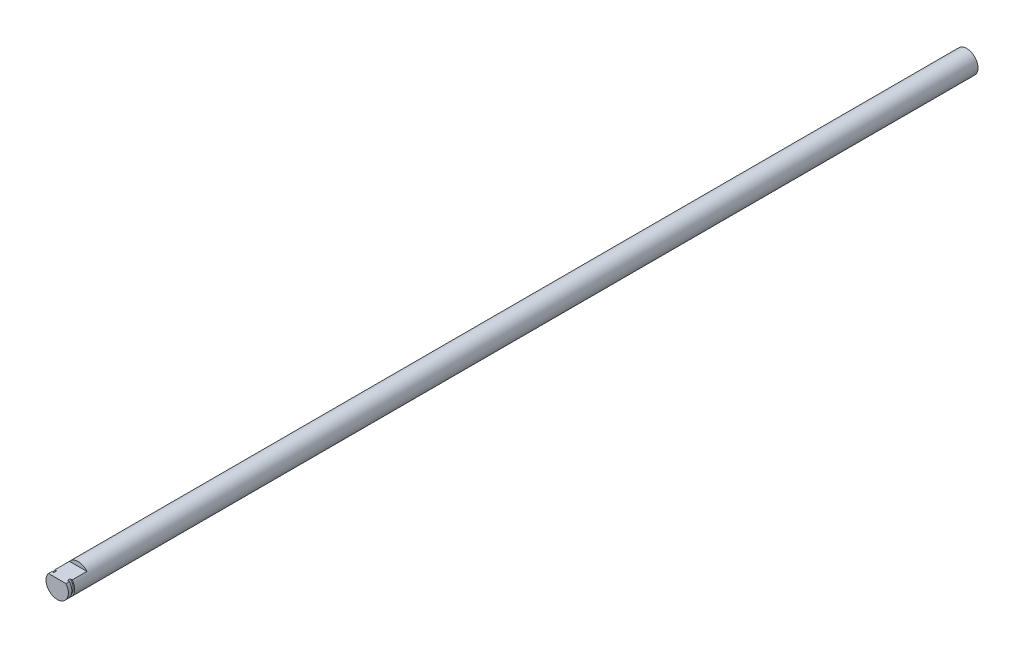
ISO-10303-21;
HEADER;
FILE_DESCRIPTION(('STEP AP214'),'2;1');
FILE_NAME('part.step','',(''),(''),'','','');
FILE_SCHEMA(('AUTOMOTIVE_DESIGN { 1 0 10303 214 1 1 1 1 }'));
ENDSEC;
DATA;
#1=APPLICATION_CONTEXT('core data for automotive mechanical design processes');
#2=APPLICATION_PROTOCOL_DEFINITION('international standard','automotive_design',2000,#1);
#3=PRODUCT_CONTEXT('',#1,'mechanical');
#4=PRODUCT('Part','Part','',(#3));
#5=PRODUCT_RELATED_PRODUCT_CATEGORY('part','',(#4));
#6=PRODUCT_DEFINITION_FORMATION('','',#4);
#7=PRODUCT_DEFINITION_CONTEXT('part definition',#1,'design');
#8=PRODUCT_DEFINITION('design','',#6,#7);
#9=PRODUCT_DEFINITION_SHAPE('','',#8);
#10=(LENGTH_UNIT() NAMED_UNIT(*) SI_UNIT(.MILLI.,.METRE.));
#11=(NAMED_UNIT(*) PLANE_ANGLE_UNIT() SI_UNIT($,.RADIAN.));
#12=(NAMED_UNIT(*) SI_UNIT($,.STERADIAN.) SOLID_ANGLE_UNIT());
#13=UNCERTAINTY_MEASURE_WITH_UNIT(LENGTH_MEASURE(1.E-05),#10,'distance_accuracy_value','');
#14=(GEOMETRIC_REPRESENTATION_CONTEXT(3) GLOBAL_UNCERTAINTY_ASSIGNED_CONTEXT((#13)) GLOBAL_UNIT_ASSIGNED_CONTEXT((#10,
#11,#12)) REPRESENTATION_CONTEXT('',''));
#15=CARTESIAN_POINT('',(0.,0.,0.));
#16=DIRECTION('',(0.,0.,1.));
#17=DIRECTION('',(1.,0.,0.));
#18=AXIS2_PLACEMENT_3D('',#15,#16,#17);
#19=CARTESIAN_POINT('',(0.,0.,325.));
#20=DIRECTION('',(0.,0.,-1.));
#21=DIRECTION('',(-1.,0.,0.));
#22=AXIS2_PLACEMENT_3D('',#19,#20,#21);
#23=CYLINDRICAL_SURFACE('',#22,4.);
#24=CARTESIAN_POINT('',(0.,0.,0.));
#25=DIRECTION('',(0.,0.,1.));
#26=DIRECTION('',(1.,0.,0.));
#27=AXIS2_PLACEMENT_3D('',#24,#25,#26);
#28=CIRCLE('',#27,4.);
#29=CARTESIAN_POINT('',(4.,0.,0.));
#30=VERTEX_POINT('',#29);
#31=EDGE_CURVE('E112',#30,#30,#28,.T.);
#32=ORIENTED_EDGE('',*,*,#31,.T.);
#33=EDGE_LOOP('',(#32));
#34=FACE_BOUND('',#33,.T.);
#35=CARTESIAN_POINT('',(0.,0.,322.75));
#36=DIRECTION('',(0.,0.,1.));
#37=DIRECTION('',(1.,0.,0.));
#38=AXIS2_PLACEMENT_3D('',#35,#36,#37);
#39=CIRCLE('',#38,4.);
#40=CARTESIAN_POINT('',(-3.1224989991992,2.5,322.75));
#41=VERTEX_POINT('',#40);
#42=CARTESIAN_POINT('',(3.1224989991992,2.5,322.75));
#43=VERTEX_POINT('',#42);
#44=EDGE_CURVE('E96',#41,#43,#39,.T.);
#45=ORIENTED_EDGE('',*,*,#44,.F.);
#46=DIRECTION('',(0.,0.,1.));
#47=VECTOR('',#46,1.);
#48=CARTESIAN_POINT('',(-3.1224989991992,2.5,317.5));
#49=LINE('',#48,#47);
#50=CARTESIAN_POINT('',(-3.1224989991992,2.5,317.5));
#51=VERTEX_POINT('',#50);
#52=EDGE_CURVE('E118',#51,#41,#49,.T.);
#53=ORIENTED_EDGE('',*,*,#52,.F.);
#54=CARTESIAN_POINT('',(0.,0.,317.5));
#55=DIRECTION('',(0.,0.,1.));
#56=DIRECTION('',(1.,0.,0.));
#57=AXIS2_PLACEMENT_3D('',#54,#55,#56);
#58=CIRCLE('',#57,4.);
#59=CARTESIAN_POINT('',(3.1224989991992,2.5,317.5));
#60=VERTEX_POINT('',#59);
#61=EDGE_CURVE('E125',#60,#51,#58,.T.);
#62=ORIENTED_EDGE('',*,*,#61,.F.);
#63=DIRECTION('',(0.,0.,1.));
#64=VECTOR('',#63,1.);
#65=CARTESIAN_POINT('',(3.1224989991992,2.5,317.5));
#66=LINE('',#65,#64);
#67=EDGE_CURVE('E115',#60,#43,#66,.T.);
#68=ORIENTED_EDGE('',*,*,#67,.T.);
#69=EDGE_LOOP('',(#45,#53,#62,#68));
#70=FACE_BOUND('',#69,.T.);
#71=ADVANCED_FACE('F35',(#34,#70),#23,.T.);
#72=CARTESIAN_POINT('',(3.1224989991992,2.5,317.5));
#73=DIRECTION('',(0.,-1.,0.));
#74=DIRECTION('',(0.,0.,-1.));
#75=AXIS2_PLACEMENT_3D('',#72,#73,#74);
#76=PLANE('',#75);
#77=DIRECTION('',(-1.,0.,0.));
#78=VECTOR('',#77,1.);
#79=CARTESIAN_POINT('',(3.1224989991992,2.5,322.75));
#80=LINE('',#79,#78);
#81=CARTESIAN_POINT('',(2.44948974278318,2.5,322.75));
#82=VERTEX_POINT('',#81);
#83=EDGE_CURVE('E11',#43,#82,#80,.T.);
#84=ORIENTED_EDGE('',*,*,#83,.F.);
#85=ORIENTED_EDGE('',*,*,#67,.F.);
#86=DIRECTION('',(1.,0.,0.));
#87=VECTOR('',#86,1.);
#88=CARTESIAN_POINT('',(3.1224989991992,2.5,317.5));
#89=LINE('',#88,#87);
#90=EDGE_CURVE('E126',#51,#60,#89,.T.);
#91=ORIENTED_EDGE('',*,*,#90,.F.);
#92=ORIENTED_EDGE('',*,*,#52,.T.);
#93=CARTESIAN_POINT('',(-2.44948974278318,2.5,322.75));
#94=VERTEX_POINT('',#93);
#95=EDGE_CURVE('E45',#94,#41,#80,.T.);
#96=ORIENTED_EDGE('',*,*,#95,.F.);
#97=DIRECTION('',(0.,0.,1.));
#98=VECTOR('',#97,1.);
#99=CARTESIAN_POINT('',(-2.44948974278318,2.5,322.75));
#100=LINE('',#99,#98);
#101=CARTESIAN_POINT('',(-2.44948974278318,2.5,323.75));
#102=VERTEX_POINT('',#101);
#103=EDGE_CURVE('E101',#102,#94,#100,.F.);
#104=ORIENTED_EDGE('',*,*,#103,.F.);
#105=DIRECTION('',(-1.,0.,0.));
#106=VECTOR('',#105,1.);
#107=CARTESIAN_POINT('',(3.1224989991992,2.5,323.75));
#108=LINE('',#107,#106);
#109=CARTESIAN_POINT('',(-3.1224989991992,2.5,323.75));
#110=VERTEX_POINT('',#109);
#111=EDGE_CURVE('E108',#102,#110,#108,.T.);
#112=ORIENTED_EDGE('',*,*,#111,.T.);
#113=CARTESIAN_POINT('',(-3.1224989991992,2.5,325.));
#114=VERTEX_POINT('',#113);
#115=EDGE_CURVE('E60',#110,#114,#49,.T.);
#116=ORIENTED_EDGE('',*,*,#115,.T.);
#117=DIRECTION('',(1.,0.,0.));
#118=VECTOR('',#117,1.);
#119=CARTESIAN_POINT('',(3.1224989991992,2.5,325.));
#120=LINE('',#119,#118);
#121=CARTESIAN_POINT('',(3.1224989991992,2.5,325.));
#122=VERTEX_POINT('',#121);
#123=EDGE_CURVE('E123',#114,#122,#120,.T.);
#124=ORIENTED_EDGE('',*,*,#123,.T.);
#125=CARTESIAN_POINT('',(3.1224989991992,2.5,323.75));
#126=VERTEX_POINT('',#125);
#127=EDGE_CURVE('E121',#126,#122,#66,.T.);
#128=ORIENTED_EDGE('',*,*,#127,.F.);
#129=CARTESIAN_POINT('',(2.44948974278318,2.5,323.75));
#130=VERTEX_POINT('',#129);
#131=EDGE_CURVE('E44',#126,#130,#108,.T.);
#132=ORIENTED_EDGE('',*,*,#131,.T.);
#133=DIRECTION('',(0.,0.,1.));
#134=VECTOR('',#133,1.);
#135=CARTESIAN_POINT('',(2.44948974278318,2.5,322.75));
#136=LINE('',#135,#134);
#137=EDGE_CURVE('E39',#82,#130,#136,.T.);
#138=ORIENTED_EDGE('',*,*,#137,.F.);
#139=EDGE_LOOP('',(#84,#85,#91,#92,#96,#104,#112,#116,#124,#128,#132,#138));
#140=FACE_BOUND('',#139,.T.);
#141=ADVANCED_FACE('F105',(#140),#76,.F.);
#142=ORIENTED_EDGE('',*,*,#115,.F.);
#143=CARTESIAN_POINT('',(0.,0.,323.75));
#144=DIRECTION('',(0.,0.,1.));
#145=DIRECTION('',(1.,0.,0.));
#146=AXIS2_PLACEMENT_3D('',#143,#144,#145);
#147=CIRCLE('',#146,4.);
#148=EDGE_CURVE('E102',#110,#126,#147,.T.);
#149=ORIENTED_EDGE('',*,*,#148,.T.);
#150=ORIENTED_EDGE('',*,*,#127,.T.);
#151=CARTESIAN_POINT('',(0.,0.,325.));
#152=DIRECTION('',(0.,0.,1.));
#153=DIRECTION('',(1.,0.,0.));
#154=AXIS2_PLACEMENT_3D('',#151,#152,#153);
#155=CIRCLE('',#154,4.);
#156=EDGE_CURVE('E111',#114,#122,#155,.T.);
#157=ORIENTED_EDGE('',*,*,#156,.F.);
#158=EDGE_LOOP('',(#142,#149,#150,#157));
#159=FACE_BOUND('',#158,.T.);
#160=ADVANCED_FACE('F37',(#159),#23,.T.);
#161=CARTESIAN_POINT('',(0.,0.,325.));
#162=DIRECTION('',(0.,0.,1.));
#163=DIRECTION('',(1.,0.,0.));
#164=AXIS2_PLACEMENT_3D('',#161,#162,#163);
#165=PLANE('',#164);
#166=ORIENTED_EDGE('',*,*,#123,.F.);
#167=ORIENTED_EDGE('',*,*,#156,.T.);
#168=EDGE_LOOP('',(#166,#167));
#169=FACE_BOUND('',#168,.T.);
#170=ADVANCED_FACE('F149',(#169),#165,.T.);
#171=CARTESIAN_POINT('',(0.,0.,0.));
#172=DIRECTION('',(0.,0.,1.));
#173=DIRECTION('',(1.,0.,0.));
#174=AXIS2_PLACEMENT_3D('',#171,#172,#173);
#175=PLANE('',#174);
#176=ORIENTED_EDGE('',*,*,#31,.F.);
#177=EDGE_LOOP('',(#176));
#178=FACE_BOUND('',#177,.T.);
#179=ADVANCED_FACE('F142',(#178),#175,.F.);
#180=CARTESIAN_POINT('',(0.,0.,317.5));
#181=DIRECTION('',(0.,0.,1.));
#182=DIRECTION('',(1.,0.,0.));
#183=AXIS2_PLACEMENT_3D('',#180,#181,#182);
#184=PLANE('',#183);
#185=ORIENTED_EDGE('',*,*,#61,.T.);
#186=ORIENTED_EDGE('',*,*,#90,.T.);
#187=EDGE_LOOP('',(#185,#186));
#188=FACE_BOUND('',#187,.T.);
#189=ADVANCED_FACE('F140',(#188),#184,.T.);
#190=CARTESIAN_POINT('',(0.,0.,322.75));
#191=DIRECTION('',(0.,0.,1.));
#192=DIRECTION('',(1.,0.,0.));
#193=AXIS2_PLACEMENT_3D('',#190,#191,#192);
#194=PLANE('',#193);
#195=ORIENTED_EDGE('',*,*,#83,.T.);
#196=CARTESIAN_POINT('',(0.,0.,322.75));
#197=DIRECTION('',(0.,0.,1.));
#198=DIRECTION('',(1.,0.,0.));
#199=AXIS2_PLACEMENT_3D('',#196,#197,#198);
#200=CIRCLE('',#199,3.5);
#201=EDGE_CURVE('E93',#94,#82,#200,.T.);
#202=ORIENTED_EDGE('',*,*,#201,.F.);
#203=ORIENTED_EDGE('',*,*,#95,.T.);
#204=ORIENTED_EDGE('',*,*,#44,.T.);
#205=EDGE_LOOP('',(#195,#202,#203,#204));
#206=FACE_BOUND('',#205,.T.);
#207=ADVANCED_FACE('F92',(#206),#194,.T.);
#208=CARTESIAN_POINT('',(0.,0.,323.75));
#209=DIRECTION('',(0.,0.,1.));
#210=DIRECTION('',(1.,0.,0.));
#211=AXIS2_PLACEMENT_3D('',#208,#209,#210);
#212=PLANE('',#211);
#213=ORIENTED_EDGE('',*,*,#148,.F.);
#214=ORIENTED_EDGE('',*,*,#111,.F.);
#215=CARTESIAN_POINT('',(0.,0.,323.75));
#216=DIRECTION('',(0.,0.,1.));
#217=DIRECTION('',(1.,0.,0.));
#218=AXIS2_PLACEMENT_3D('',#215,#216,#217);
#219=CIRCLE('',#218,3.5);
#220=EDGE_CURVE('E52',#102,#130,#219,.T.);
#221=ORIENTED_EDGE('',*,*,#220,.T.);
#222=ORIENTED_EDGE('',*,*,#131,.F.);
#223=EDGE_LOOP('',(#213,#214,#221,#222));
#224=FACE_BOUND('',#223,.T.);
#225=ADVANCED_FACE('F134',(#224),#212,.F.);
#226=CARTESIAN_POINT('',(0.,0.,322.75));
#227=DIRECTION('',(0.,0.,1.));
#228=DIRECTION('',(1.,0.,0.));
#229=AXIS2_PLACEMENT_3D('',#226,#227,#228);
#230=CYLINDRICAL_SURFACE('',#229,3.5);
#231=ORIENTED_EDGE('',*,*,#137,.T.);
#232=ORIENTED_EDGE('',*,*,#220,.F.);
#233=ORIENTED_EDGE('',*,*,#103,.T.);
#234=ORIENTED_EDGE('',*,*,#201,.T.);
#235=EDGE_LOOP('',(#231,#232,#233,#234));
#236=FACE_BOUND('',#235,.T.);
#237=ADVANCED_FACE('F99',(#236),#230,.T.);
#238=CLOSED_SHELL('',(#71,#141,#160,#170,#179,#189,#207,#225,#237));
#239=MANIFOLD_SOLID_BREP('B2',#238);
#240=ADVANCED_BREP_SHAPE_REPRESENTATION('',(#18,#239),#14);
#241=SHAPE_DEFINITION_REPRESENTATION(#9,#240);
ENDSEC;
END-ISO-10303-21;
